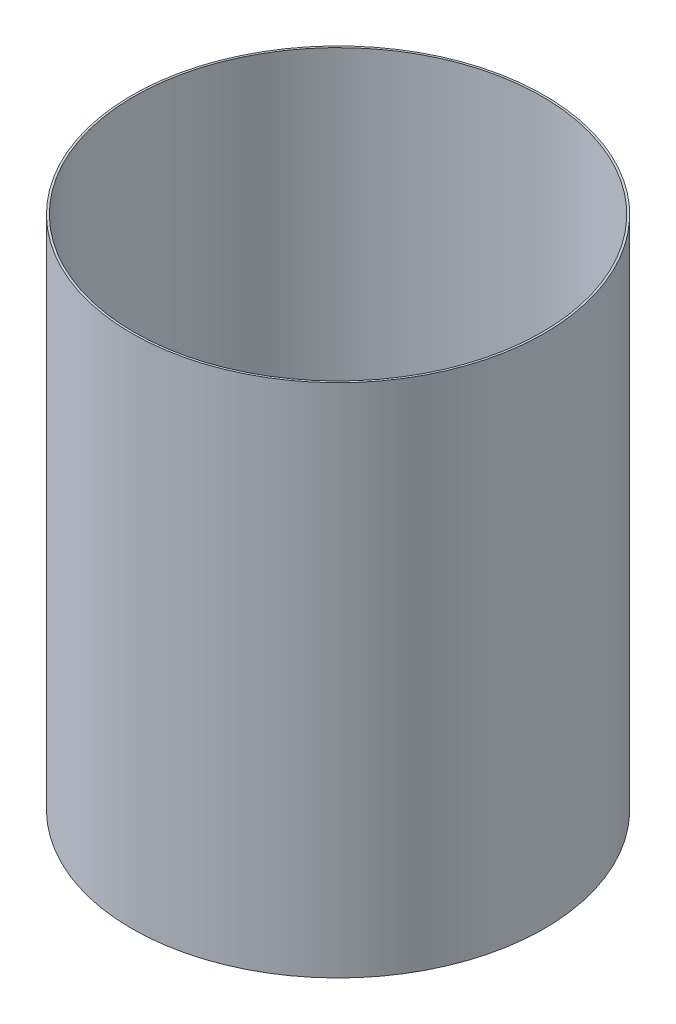
ISO-10303-21;
HEADER;
FILE_DESCRIPTION(('STEP AP214'),'2;1');
FILE_NAME('part.step','',(''),(''),'','','');
FILE_SCHEMA(('AUTOMOTIVE_DESIGN { 1 0 10303 214 1 1 1 1 }'));
ENDSEC;
DATA;
#1=APPLICATION_CONTEXT('core data for automotive mechanical design processes');
#2=APPLICATION_PROTOCOL_DEFINITION('international standard','automotive_design',2000,#1);
#3=PRODUCT_CONTEXT('',#1,'mechanical');
#4=PRODUCT('Part','Part','',(#3));
#5=PRODUCT_RELATED_PRODUCT_CATEGORY('part','',(#4));
#6=PRODUCT_DEFINITION_FORMATION('','',#4);
#7=PRODUCT_DEFINITION_CONTEXT('part definition',#1,'design');
#8=PRODUCT_DEFINITION('design','',#6,#7);
#9=PRODUCT_DEFINITION_SHAPE('','',#8);
#10=(LENGTH_UNIT() NAMED_UNIT(*) SI_UNIT(.MILLI.,.METRE.));
#11=(NAMED_UNIT(*) PLANE_ANGLE_UNIT() SI_UNIT($,.RADIAN.));
#12=(NAMED_UNIT(*) SI_UNIT($,.STERADIAN.) SOLID_ANGLE_UNIT());
#13=UNCERTAINTY_MEASURE_WITH_UNIT(LENGTH_MEASURE(1.E-05),#10,'distance_accuracy_value','');
#14=(GEOMETRIC_REPRESENTATION_CONTEXT(3) GLOBAL_UNCERTAINTY_ASSIGNED_CONTEXT((#13)) GLOBAL_UNIT_ASSIGNED_CONTEXT((#10,
#11,#12)) REPRESENTATION_CONTEXT('',''));
#15=CARTESIAN_POINT('',(0.,0.,0.));
#16=DIRECTION('',(0.,0.,1.));
#17=DIRECTION('',(1.,0.,0.));
#18=AXIS2_PLACEMENT_3D('',#15,#16,#17);
#19=CARTESIAN_POINT('',(0.,25.,0.));
#20=DIRECTION('',(0.,1.,0.));
#21=DIRECTION('',(0.,0.,1.));
#22=AXIS2_PLACEMENT_3D('',#19,#20,#21);
#23=PLANE('',#22);
#24=CARTESIAN_POINT('',(0.,25.,0.));
#25=DIRECTION('',(0.,1.,0.));
#26=DIRECTION('',(0.,0.,1.));
#27=AXIS2_PLACEMENT_3D('',#24,#25,#26);
#28=CIRCLE('',#27,10.);
#29=CARTESIAN_POINT('',(0.,25.,10.));
#30=VERTEX_POINT('',#29);
#31=EDGE_CURVE('E10',#30,#30,#28,.T.);
#32=ORIENTED_EDGE('',*,*,#31,.T.);
#33=EDGE_LOOP('',(#32));
#34=FACE_BOUND('',#33,.T.);
#35=CARTESIAN_POINT('',(0.,25.,0.));
#36=DIRECTION('',(0.,1.,0.));
#37=DIRECTION('',(0.,0.,1.));
#38=AXIS2_PLACEMENT_3D('',#35,#36,#37);
#39=CIRCLE('',#38,9.9);
#40=CARTESIAN_POINT('',(0.,25.,9.9));
#41=VERTEX_POINT('',#40);
#42=EDGE_CURVE('E42',#41,#41,#39,.T.);
#43=ORIENTED_EDGE('',*,*,#42,.F.);
#44=EDGE_LOOP('',(#43));
#45=FACE_BOUND('',#44,.T.);
#46=ADVANCED_FACE('F31',(#34,#45),#23,.T.);
#47=CARTESIAN_POINT('',(0.,0.,0.));
#48=DIRECTION('',(0.,1.,0.));
#49=DIRECTION('',(0.,0.,1.));
#50=AXIS2_PLACEMENT_3D('',#47,#48,#49);
#51=PLANE('',#50);
#52=CARTESIAN_POINT('',(0.,0.,0.));
#53=DIRECTION('',(0.,1.,0.));
#54=DIRECTION('',(0.,0.,1.));
#55=AXIS2_PLACEMENT_3D('',#52,#53,#54);
#56=CIRCLE('',#55,10.);
#57=CARTESIAN_POINT('',(0.,0.,10.));
#58=VERTEX_POINT('',#57);
#59=EDGE_CURVE('E35',#58,#58,#56,.T.);
#60=ORIENTED_EDGE('',*,*,#59,.F.);
#61=EDGE_LOOP('',(#60));
#62=FACE_BOUND('',#61,.T.);
#63=CARTESIAN_POINT('',(0.,0.,0.));
#64=DIRECTION('',(0.,1.,0.));
#65=DIRECTION('',(0.,0.,1.));
#66=AXIS2_PLACEMENT_3D('',#63,#64,#65);
#67=CIRCLE('',#66,9.9);
#68=CARTESIAN_POINT('',(0.,0.,9.9));
#69=VERTEX_POINT('',#68);
#70=EDGE_CURVE('E44',#69,#69,#67,.T.);
#71=ORIENTED_EDGE('',*,*,#70,.T.);
#72=EDGE_LOOP('',(#71));
#73=FACE_BOUND('',#72,.T.);
#74=ADVANCED_FACE('F54',(#62,#73),#51,.F.);
#75=CARTESIAN_POINT('',(0.,25.,0.));
#76=DIRECTION('',(0.,-1.,0.));
#77=DIRECTION('',(0.,0.,-1.));
#78=AXIS2_PLACEMENT_3D('',#75,#76,#77);
#79=CYLINDRICAL_SURFACE('',#78,10.);
#80=ORIENTED_EDGE('',*,*,#31,.F.);
#81=EDGE_LOOP('',(#80));
#82=FACE_BOUND('',#81,.T.);
#83=ORIENTED_EDGE('',*,*,#59,.T.);
#84=EDGE_LOOP('',(#83));
#85=FACE_BOUND('',#84,.T.);
#86=ADVANCED_FACE('F33',(#82,#85),#79,.T.);
#87=CARTESIAN_POINT('',(0.,25.,0.));
#88=DIRECTION('',(0.,-1.,0.));
#89=DIRECTION('',(0.,0.,-1.));
#90=AXIS2_PLACEMENT_3D('',#87,#88,#89);
#91=CYLINDRICAL_SURFACE('',#90,9.9);
#92=ORIENTED_EDGE('',*,*,#42,.T.);
#93=EDGE_LOOP('',(#92));
#94=FACE_BOUND('',#93,.T.);
#95=ORIENTED_EDGE('',*,*,#70,.F.);
#96=EDGE_LOOP('',(#95));
#97=FACE_BOUND('',#96,.T.);
#98=ADVANCED_FACE('F50',(#94,#97),#91,.F.);
#99=CLOSED_SHELL('',(#46,#74,#86,#98));
#100=MANIFOLD_SOLID_BREP('B2',#99);
#101=ADVANCED_BREP_SHAPE_REPRESENTATION('',(#18,#100),#14);
#102=SHAPE_DEFINITION_REPRESENTATION(#9,#101);
ENDSEC;
END-ISO-10303-21;
